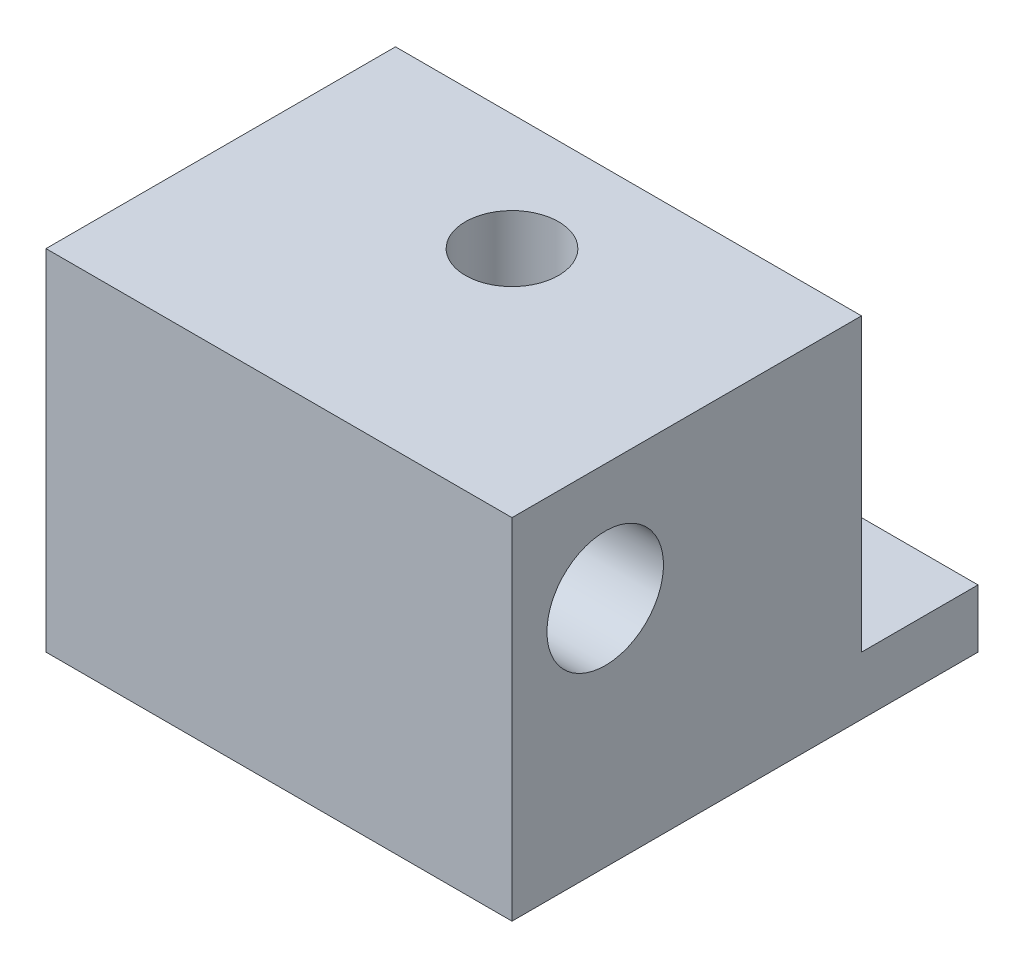
ISO-10303-21;
HEADER;
FILE_DESCRIPTION(('STEP AP214'),'2;1');
FILE_NAME('part.step','',(''),(''),'','','');
FILE_SCHEMA(('AUTOMOTIVE_DESIGN { 1 0 10303 214 1 1 1 1 }'));
ENDSEC;
DATA;
#1=APPLICATION_CONTEXT('core data for automotive mechanical design processes');
#2=APPLICATION_PROTOCOL_DEFINITION('international standard','automotive_design',2000,#1);
#3=PRODUCT_CONTEXT('',#1,'mechanical');
#4=PRODUCT('Part','Part','',(#3));
#5=PRODUCT_RELATED_PRODUCT_CATEGORY('part','',(#4));
#6=PRODUCT_DEFINITION_FORMATION('','',#4);
#7=PRODUCT_DEFINITION_CONTEXT('part definition',#1,'design');
#8=PRODUCT_DEFINITION('design','',#6,#7);
#9=PRODUCT_DEFINITION_SHAPE('','',#8);
#10=(LENGTH_UNIT() NAMED_UNIT(*) SI_UNIT(.MILLI.,.METRE.));
#11=(NAMED_UNIT(*) PLANE_ANGLE_UNIT() SI_UNIT($,.RADIAN.));
#12=(NAMED_UNIT(*) SI_UNIT($,.STERADIAN.) SOLID_ANGLE_UNIT());
#13=UNCERTAINTY_MEASURE_WITH_UNIT(LENGTH_MEASURE(1.E-05),#10,'distance_accuracy_value','');
#14=(GEOMETRIC_REPRESENTATION_CONTEXT(3) GLOBAL_UNCERTAINTY_ASSIGNED_CONTEXT((#13)) GLOBAL_UNIT_ASSIGNED_CONTEXT((#10,
#11,#12)) REPRESENTATION_CONTEXT('',''));
#15=CARTESIAN_POINT('',(0.,0.,0.));
#16=DIRECTION('',(0.,0.,1.));
#17=DIRECTION('',(1.,0.,0.));
#18=AXIS2_PLACEMENT_3D('',#15,#16,#17);
#19=CARTESIAN_POINT('',(20.,30.,20.));
#20=DIRECTION('',(-1.,0.,0.));
#21=DIRECTION('',(0.,0.,1.));
#22=AXIS2_PLACEMENT_3D('',#19,#20,#21);
#23=PLANE('',#22);
#24=CARTESIAN_POINT('',(20.,20.,12.));
#25=DIRECTION('',(-1.,0.,0.));
#26=DIRECTION('',(0.,0.,1.));
#27=AXIS2_PLACEMENT_3D('',#24,#25,#26);
#28=CIRCLE('',#27,5.);
#29=CARTESIAN_POINT('',(20.,20.,17.));
#30=VERTEX_POINT('',#29);
#31=EDGE_CURVE('E144',#30,#30,#28,.T.);
#32=ORIENTED_EDGE('',*,*,#31,.T.);
#33=EDGE_LOOP('',(#32));
#34=FACE_BOUND('',#33,.T.);
#35=DIRECTION('',(0.,0.,1.));
#36=VECTOR('',#35,1.);
#37=CARTESIAN_POINT('',(20.,5.,-20.));
#38=LINE('',#37,#36);
#39=CARTESIAN_POINT('',(20.,5.,-20.));
#40=VERTEX_POINT('',#39);
#41=CARTESIAN_POINT('',(20.,5.,-10.));
#42=VERTEX_POINT('',#41);
#43=EDGE_CURVE('E127',#40,#42,#38,.T.);
#44=ORIENTED_EDGE('',*,*,#43,.T.);
#45=DIRECTION('',(0.,1.,0.));
#46=VECTOR('',#45,1.);
#47=CARTESIAN_POINT('',(20.,30.,-10.));
#48=LINE('',#47,#46);
#49=CARTESIAN_POINT('',(20.,30.,-10.));
#50=VERTEX_POINT('',#49);
#51=EDGE_CURVE('E137',#42,#50,#48,.T.);
#52=ORIENTED_EDGE('',*,*,#51,.T.);
#53=DIRECTION('',(0.,0.,-1.));
#54=VECTOR('',#53,1.);
#55=CARTESIAN_POINT('',(20.,30.,20.));
#56=LINE('',#55,#54);
#57=CARTESIAN_POINT('',(20.,30.,20.));
#58=VERTEX_POINT('',#57);
#59=EDGE_CURVE('E86',#58,#50,#56,.T.);
#60=ORIENTED_EDGE('',*,*,#59,.F.);
#61=DIRECTION('',(0.,-1.,0.));
#62=VECTOR('',#61,1.);
#63=CARTESIAN_POINT('',(20.,30.,20.));
#64=LINE('',#63,#62);
#65=CARTESIAN_POINT('',(20.,0.,20.));
#66=VERTEX_POINT('',#65);
#67=EDGE_CURVE('E79',#58,#66,#64,.T.);
#68=ORIENTED_EDGE('',*,*,#67,.T.);
#69=DIRECTION('',(0.,0.,-1.));
#70=VECTOR('',#69,1.);
#71=CARTESIAN_POINT('',(20.,0.,20.));
#72=LINE('',#71,#70);
#73=CARTESIAN_POINT('',(20.,0.,-20.));
#74=VERTEX_POINT('',#73);
#75=EDGE_CURVE('E93',#66,#74,#72,.T.);
#76=ORIENTED_EDGE('',*,*,#75,.T.);
#77=DIRECTION('',(0.,-1.,0.));
#78=VECTOR('',#77,1.);
#79=CARTESIAN_POINT('',(20.,30.,-20.));
#80=LINE('',#79,#78);
#81=EDGE_CURVE('E11',#40,#74,#80,.T.);
#82=ORIENTED_EDGE('',*,*,#81,.F.);
#83=EDGE_LOOP('',(#44,#52,#60,#68,#76,#82));
#84=FACE_BOUND('',#83,.T.);
#85=ADVANCED_FACE('F34',(#34,#84),#23,.F.);
#86=CARTESIAN_POINT('',(-20.,30.,-20.));
#87=DIRECTION('',(0.,0.,1.));
#88=DIRECTION('',(1.,0.,0.));
#89=AXIS2_PLACEMENT_3D('',#86,#87,#88);
#90=PLANE('',#89);
#91=DIRECTION('',(0.,-1.,0.));
#92=VECTOR('',#91,1.);
#93=CARTESIAN_POINT('',(-20.,30.,-20.));
#94=LINE('',#93,#92);
#95=CARTESIAN_POINT('',(-20.,5.,-20.));
#96=VERTEX_POINT('',#95);
#97=CARTESIAN_POINT('',(-20.,0.,-20.));
#98=VERTEX_POINT('',#97);
#99=EDGE_CURVE('E42',#96,#98,#94,.T.);
#100=ORIENTED_EDGE('',*,*,#99,.F.);
#101=DIRECTION('',(-1.,0.,0.));
#102=VECTOR('',#101,1.);
#103=CARTESIAN_POINT('',(20.,5.,-20.));
#104=LINE('',#103,#102);
#105=EDGE_CURVE('E124',#40,#96,#104,.T.);
#106=ORIENTED_EDGE('',*,*,#105,.F.);
#107=ORIENTED_EDGE('',*,*,#81,.T.);
#108=DIRECTION('',(-1.,0.,0.));
#109=VECTOR('',#108,1.);
#110=CARTESIAN_POINT('',(-20.,0.,-20.));
#111=LINE('',#110,#109);
#112=EDGE_CURVE('E99',#74,#98,#111,.T.);
#113=ORIENTED_EDGE('',*,*,#112,.T.);
#114=EDGE_LOOP('',(#100,#106,#107,#113));
#115=FACE_BOUND('',#114,.T.);
#116=ADVANCED_FACE('F121',(#115),#90,.F.);
#117=CARTESIAN_POINT('',(-20.,30.,20.));
#118=DIRECTION('',(1.,0.,0.));
#119=DIRECTION('',(0.,0.,-1.));
#120=AXIS2_PLACEMENT_3D('',#117,#118,#119);
#121=PLANE('',#120);
#122=CARTESIAN_POINT('',(-20.,20.,12.));
#123=DIRECTION('',(1.,0.,0.));
#124=DIRECTION('',(0.,0.,-1.));
#125=AXIS2_PLACEMENT_3D('',#122,#123,#124);
#126=CIRCLE('',#125,5.);
#127=CARTESIAN_POINT('',(-20.,20.,7.));
#128=VERTEX_POINT('',#127);
#129=EDGE_CURVE('E37',#128,#128,#126,.T.);
#130=ORIENTED_EDGE('',*,*,#129,.T.);
#131=EDGE_LOOP('',(#130));
#132=FACE_BOUND('',#131,.T.);
#133=DIRECTION('',(0.,0.,1.));
#134=VECTOR('',#133,1.);
#135=CARTESIAN_POINT('',(-20.,30.,20.));
#136=LINE('',#135,#134);
#137=CARTESIAN_POINT('',(-20.,30.,-10.));
#138=VERTEX_POINT('',#137);
#139=CARTESIAN_POINT('',(-20.,30.,20.));
#140=VERTEX_POINT('',#139);
#141=EDGE_CURVE('E149',#138,#140,#136,.T.);
#142=ORIENTED_EDGE('',*,*,#141,.F.);
#143=DIRECTION('',(0.,1.,0.));
#144=VECTOR('',#143,1.);
#145=CARTESIAN_POINT('',(-20.,30.,-10.));
#146=LINE('',#145,#144);
#147=CARTESIAN_POINT('',(-20.,5.,-10.));
#148=VERTEX_POINT('',#147);
#149=EDGE_CURVE('E49',#148,#138,#146,.T.);
#150=ORIENTED_EDGE('',*,*,#149,.F.);
#151=DIRECTION('',(0.,0.,1.));
#152=VECTOR('',#151,1.);
#153=CARTESIAN_POINT('',(-20.,5.,-20.));
#154=LINE('',#153,#152);
#155=EDGE_CURVE('E118',#96,#148,#154,.T.);
#156=ORIENTED_EDGE('',*,*,#155,.F.);
#157=ORIENTED_EDGE('',*,*,#99,.T.);
#158=DIRECTION('',(0.,0.,1.));
#159=VECTOR('',#158,1.);
#160=CARTESIAN_POINT('',(-20.,0.,20.));
#161=LINE('',#160,#159);
#162=CARTESIAN_POINT('',(-20.,0.,20.));
#163=VERTEX_POINT('',#162);
#164=EDGE_CURVE('E87',#98,#163,#161,.T.);
#165=ORIENTED_EDGE('',*,*,#164,.T.);
#166=DIRECTION('',(0.,-1.,0.));
#167=VECTOR('',#166,1.);
#168=CARTESIAN_POINT('',(-20.,30.,20.));
#169=LINE('',#168,#167);
#170=EDGE_CURVE('E82',#140,#163,#169,.T.);
#171=ORIENTED_EDGE('',*,*,#170,.F.);
#172=EDGE_LOOP('',(#142,#150,#156,#157,#165,#171));
#173=FACE_BOUND('',#172,.T.);
#174=ADVANCED_FACE('F115',(#132,#173),#121,.F.);
#175=CARTESIAN_POINT('',(-20.,30.,20.));
#176=DIRECTION('',(0.,0.,-1.));
#177=DIRECTION('',(-1.,0.,0.));
#178=AXIS2_PLACEMENT_3D('',#175,#176,#177);
#179=PLANE('',#178);
#180=DIRECTION('',(1.,0.,0.));
#181=VECTOR('',#180,1.);
#182=CARTESIAN_POINT('',(-20.,0.,20.));
#183=LINE('',#182,#181);
#184=EDGE_CURVE('E76',#163,#66,#183,.T.);
#185=ORIENTED_EDGE('',*,*,#184,.T.);
#186=ORIENTED_EDGE('',*,*,#67,.F.);
#187=DIRECTION('',(1.,0.,0.));
#188=VECTOR('',#187,1.);
#189=CARTESIAN_POINT('',(-20.,30.,20.));
#190=LINE('',#189,#188);
#191=EDGE_CURVE('E58',#140,#58,#190,.T.);
#192=ORIENTED_EDGE('',*,*,#191,.F.);
#193=ORIENTED_EDGE('',*,*,#170,.T.);
#194=EDGE_LOOP('',(#185,#186,#192,#193));
#195=FACE_BOUND('',#194,.T.);
#196=ADVANCED_FACE('F78',(#195),#179,.F.);
#197=CARTESIAN_POINT('',(0.,30.,0.));
#198=DIRECTION('',(0.,-1.,0.));
#199=DIRECTION('',(0.,0.,-1.));
#200=AXIS2_PLACEMENT_3D('',#197,#198,#199);
#201=PLANE('',#200);
#202=CARTESIAN_POINT('',(0.,30.,0.));
#203=DIRECTION('',(0.,1.,0.));
#204=DIRECTION('',(0.,0.,1.));
#205=AXIS2_PLACEMENT_3D('',#202,#203,#204);
#206=CIRCLE('',#205,4.);
#207=CARTESIAN_POINT('',(0.,30.,4.));
#208=VERTEX_POINT('',#207);
#209=EDGE_CURVE('E104',#208,#208,#206,.T.);
#210=ORIENTED_EDGE('',*,*,#209,.F.);
#211=EDGE_LOOP('',(#210));
#212=FACE_BOUND('',#211,.T.);
#213=ORIENTED_EDGE('',*,*,#59,.T.);
#214=DIRECTION('',(-1.,0.,0.));
#215=VECTOR('',#214,1.);
#216=CARTESIAN_POINT('',(20.,30.,-10.));
#217=LINE('',#216,#215);
#218=EDGE_CURVE('E139',#50,#138,#217,.T.);
#219=ORIENTED_EDGE('',*,*,#218,.T.);
#220=ORIENTED_EDGE('',*,*,#141,.T.);
#221=ORIENTED_EDGE('',*,*,#191,.T.);
#222=EDGE_LOOP('',(#213,#219,#220,#221));
#223=FACE_BOUND('',#222,.T.);
#224=ADVANCED_FACE('F150',(#212,#223),#201,.F.);
#225=CARTESIAN_POINT('',(0.,0.,0.));
#226=DIRECTION('',(0.,-1.,0.));
#227=DIRECTION('',(0.,0.,-1.));
#228=AXIS2_PLACEMENT_3D('',#225,#226,#227);
#229=PLANE('',#228);
#230=CARTESIAN_POINT('',(0.,0.,0.));
#231=DIRECTION('',(0.,1.,0.));
#232=DIRECTION('',(0.,0.,1.));
#233=AXIS2_PLACEMENT_3D('',#230,#231,#232);
#234=CIRCLE('',#233,4.);
#235=CARTESIAN_POINT('',(0.,0.,4.));
#236=VERTEX_POINT('',#235);
#237=EDGE_CURVE('E100',#236,#236,#234,.T.);
#238=ORIENTED_EDGE('',*,*,#237,.T.);
#239=EDGE_LOOP('',(#238));
#240=FACE_BOUND('',#239,.T.);
#241=ORIENTED_EDGE('',*,*,#75,.F.);
#242=ORIENTED_EDGE('',*,*,#184,.F.);
#243=ORIENTED_EDGE('',*,*,#164,.F.);
#244=ORIENTED_EDGE('',*,*,#112,.F.);
#245=EDGE_LOOP('',(#241,#242,#243,#244));
#246=FACE_BOUND('',#245,.T.);
#247=ADVANCED_FACE('F97',(#240,#246),#229,.T.);
#248=CARTESIAN_POINT('',(0.,0.,0.));
#249=DIRECTION('',(0.,1.,0.));
#250=DIRECTION('',(0.,0.,1.));
#251=AXIS2_PLACEMENT_3D('',#248,#249,#250);
#252=CYLINDRICAL_SURFACE('',#251,4.);
#253=ORIENTED_EDGE('',*,*,#237,.F.);
#254=EDGE_LOOP('',(#253));
#255=FACE_BOUND('',#254,.T.);
#256=ORIENTED_EDGE('',*,*,#209,.T.);
#257=EDGE_LOOP('',(#256));
#258=FACE_BOUND('',#257,.T.);
#259=ADVANCED_FACE('F164',(#255,#258),#252,.F.);
#260=CARTESIAN_POINT('',(20.,20.,12.));
#261=DIRECTION('',(-1.,0.,0.));
#262=DIRECTION('',(0.,0.,1.));
#263=AXIS2_PLACEMENT_3D('',#260,#261,#262);
#264=CYLINDRICAL_SURFACE('',#263,5.);
#265=ORIENTED_EDGE('',*,*,#31,.F.);
#266=EDGE_LOOP('',(#265));
#267=FACE_BOUND('',#266,.T.);
#268=ORIENTED_EDGE('',*,*,#129,.F.);
#269=EDGE_LOOP('',(#268));
#270=FACE_BOUND('',#269,.T.);
#271=ADVANCED_FACE('F157',(#267,#270),#264,.F.);
#272=CARTESIAN_POINT('',(20.,30.,-10.));
#273=DIRECTION('',(0.,0.,1.));
#274=DIRECTION('',(0.,-1.,0.));
#275=AXIS2_PLACEMENT_3D('',#272,#273,#274);
#276=PLANE('',#275);
#277=ORIENTED_EDGE('',*,*,#149,.T.);
#278=ORIENTED_EDGE('',*,*,#218,.F.);
#279=ORIENTED_EDGE('',*,*,#51,.F.);
#280=DIRECTION('',(-1.,0.,0.));
#281=VECTOR('',#280,1.);
#282=CARTESIAN_POINT('',(20.,5.,-10.));
#283=LINE('',#282,#281);
#284=EDGE_CURVE('E136',#42,#148,#283,.T.);
#285=ORIENTED_EDGE('',*,*,#284,.T.);
#286=EDGE_LOOP('',(#277,#278,#279,#285));
#287=FACE_BOUND('',#286,.T.);
#288=ADVANCED_FACE('F155',(#287),#276,.F.);
#289=CARTESIAN_POINT('',(20.,5.,-20.));
#290=DIRECTION('',(0.,-1.,0.));
#291=DIRECTION('',(0.,0.,-1.));
#292=AXIS2_PLACEMENT_3D('',#289,#290,#291);
#293=PLANE('',#292);
#294=ORIENTED_EDGE('',*,*,#155,.T.);
#295=ORIENTED_EDGE('',*,*,#284,.F.);
#296=ORIENTED_EDGE('',*,*,#43,.F.);
#297=ORIENTED_EDGE('',*,*,#105,.T.);
#298=EDGE_LOOP('',(#294,#295,#296,#297));
#299=FACE_BOUND('',#298,.T.);
#300=ADVANCED_FACE('F135',(#299),#293,.F.);
#301=CLOSED_SHELL('',(#85,#116,#174,#196,#224,#247,#259,#271,#288,#300));
#302=MANIFOLD_SOLID_BREP('B2',#301);
#303=ADVANCED_BREP_SHAPE_REPRESENTATION('',(#18,#302),#14);
#304=SHAPE_DEFINITION_REPRESENTATION(#9,#303);
ENDSEC;
END-ISO-10303-21;
